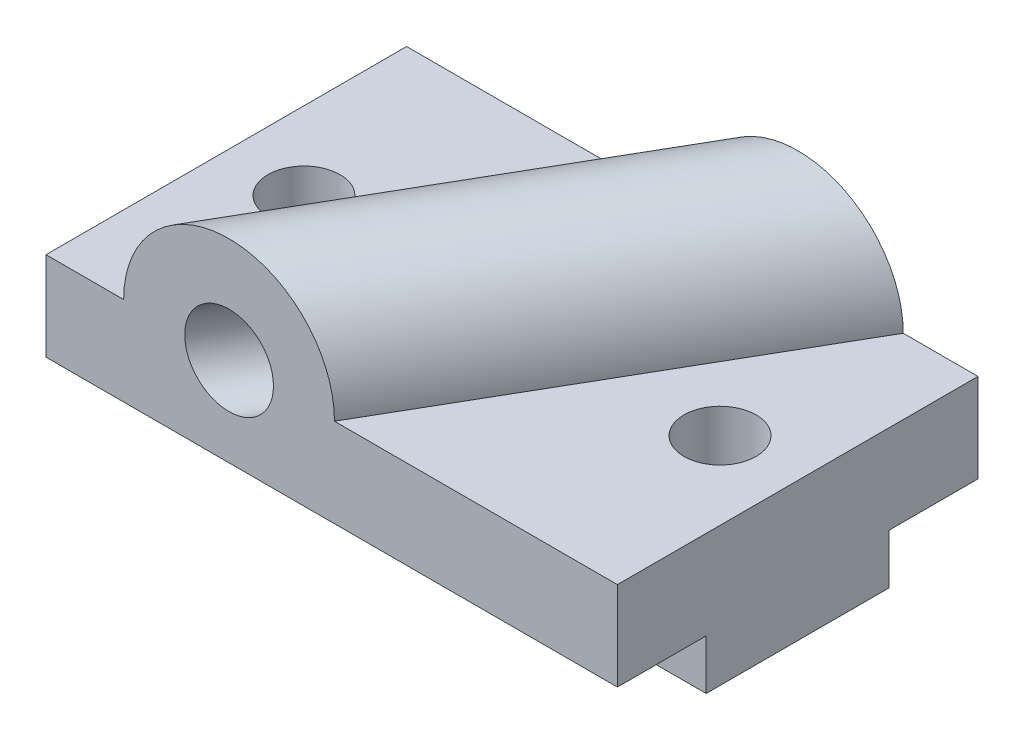
ISO-10303-21;
HEADER;
FILE_DESCRIPTION(('STEP AP214'),'2;1');
FILE_NAME('part.step','',(''),(''),'','','');
FILE_SCHEMA(('AUTOMOTIVE_DESIGN { 1 0 10303 214 1 1 1 1 }'));
ENDSEC;
DATA;
#1=APPLICATION_CONTEXT('core data for automotive mechanical design processes');
#2=APPLICATION_PROTOCOL_DEFINITION('international standard','automotive_design',2000,#1);
#3=PRODUCT_CONTEXT('',#1,'mechanical');
#4=PRODUCT('Part','Part','',(#3));
#5=PRODUCT_RELATED_PRODUCT_CATEGORY('part','',(#4));
#6=PRODUCT_DEFINITION_FORMATION('','',#4);
#7=PRODUCT_DEFINITION_CONTEXT('part definition',#1,'design');
#8=PRODUCT_DEFINITION('design','',#6,#7);
#9=PRODUCT_DEFINITION_SHAPE('','',#8);
#10=(LENGTH_UNIT() NAMED_UNIT(*) SI_UNIT(.MILLI.,.METRE.));
#11=(NAMED_UNIT(*) PLANE_ANGLE_UNIT() SI_UNIT($,.RADIAN.));
#12=(NAMED_UNIT(*) SI_UNIT($,.STERADIAN.) SOLID_ANGLE_UNIT());
#13=UNCERTAINTY_MEASURE_WITH_UNIT(LENGTH_MEASURE(1.E-05),#10,'distance_accuracy_value','');
#14=(GEOMETRIC_REPRESENTATION_CONTEXT(3) GLOBAL_UNCERTAINTY_ASSIGNED_CONTEXT((#13)) GLOBAL_UNIT_ASSIGNED_CONTEXT((#10,
#11,#12)) REPRESENTATION_CONTEXT('',''));
#15=CARTESIAN_POINT('',(0.,0.,0.));
#16=DIRECTION('',(0.,0.,1.));
#17=DIRECTION('',(1.,0.,0.));
#18=AXIS2_PLACEMENT_3D('',#15,#16,#17);
#19=CARTESIAN_POINT('',(51.5,0.,-32.5));
#20=DIRECTION('',(0.,-1.,0.));
#21=DIRECTION('',(0.,0.,-1.));
#22=AXIS2_PLACEMENT_3D('',#19,#20,#21);
#23=PLANE('',#22);
#24=CARTESIAN_POINT('',(37.5,0.,0.));
#25=DIRECTION('',(0.,-1.,0.));
#26=DIRECTION('',(0.,0.,1.));
#27=AXIS2_PLACEMENT_3D('',#24,#25,#26);
#28=CIRCLE('',#27,6.5);
#29=CARTESIAN_POINT('',(37.5,0.,6.5));
#30=VERTEX_POINT('',#29);
#31=EDGE_CURVE('E131',#30,#30,#28,.T.);
#32=ORIENTED_EDGE('',*,*,#31,.T.);
#33=EDGE_LOOP('',(#32));
#34=FACE_BOUND('',#33,.T.);
#35=DIRECTION('',(-1.,0.,0.));
#36=VECTOR('',#35,1.);
#37=CARTESIAN_POINT('',(51.5,0.,-32.5));
#38=LINE('',#37,#36);
#39=CARTESIAN_POINT('',(51.5,0.,-32.5));
#40=VERTEX_POINT('',#39);
#41=CARTESIAN_POINT('',(38.0277674973261,0.,-32.5));
#42=VERTEX_POINT('',#41);
#43=EDGE_CURVE('E48',#40,#42,#38,.T.);
#44=ORIENTED_EDGE('',*,*,#43,.T.);
#45=DIRECTION('',(-0.500000000000004,0.,0.866025403784436));
#46=VECTOR('',#45,1.);
#47=CARTESIAN_POINT('',(60.9135376534405,0.,-72.1393166807332));
#48=LINE('',#47,#46);
#49=CARTESIAN_POINT('',(0.5,0.,32.5));
#50=VERTEX_POINT('',#49);
#51=EDGE_CURVE('E127',#42,#50,#48,.T.);
#52=ORIENTED_EDGE('',*,*,#51,.T.);
#53=DIRECTION('',(-1.,0.,0.));
#54=VECTOR('',#53,1.);
#55=CARTESIAN_POINT('',(51.5,0.,32.5));
#56=LINE('',#55,#54);
#57=CARTESIAN_POINT('',(51.5,0.,32.5));
#58=VERTEX_POINT('',#57);
#59=EDGE_CURVE('E120',#58,#50,#56,.T.);
#60=ORIENTED_EDGE('',*,*,#59,.F.);
#61=DIRECTION('',(0.,0.,1.));
#62=VECTOR('',#61,1.);
#63=CARTESIAN_POINT('',(51.5,0.,-32.5));
#64=LINE('',#63,#62);
#65=EDGE_CURVE('E225',#40,#58,#64,.T.);
#66=ORIENTED_EDGE('',*,*,#65,.F.);
#67=EDGE_LOOP('',(#44,#52,#60,#66));
#68=FACE_BOUND('',#67,.T.);
#69=ADVANCED_FACE('F33',(#34,#68),#23,.F.);
#70=CARTESIAN_POINT('',(51.5,0.,32.5));
#71=DIRECTION('',(0.,0.,-1.));
#72=DIRECTION('',(-1.,0.,0.));
#73=AXIS2_PLACEMENT_3D('',#70,#71,#72);
#74=PLANE('',#73);
#75=CARTESIAN_POINT('',(-18.5,0.,32.5));
#76=DIRECTION('',(0.,0.,1.));
#77=DIRECTION('',(1.,0.,0.));
#78=AXIS2_PLACEMENT_3D('',#75,#76,#77);
#79=CIRCLE('',#78,8.);
#80=CARTESIAN_POINT('',(-10.5,0.,32.5));
#81=VERTEX_POINT('',#80);
#82=EDGE_CURVE('E276',#81,#81,#79,.T.);
#83=ORIENTED_EDGE('',*,*,#82,.F.);
#84=EDGE_LOOP('',(#83));
#85=FACE_BOUND('',#84,.T.);
#86=DIRECTION('',(0.,-1.,0.));
#87=VECTOR('',#86,1.);
#88=CARTESIAN_POINT('',(-51.5,0.,32.5));
#89=LINE('',#88,#87);
#90=CARTESIAN_POINT('',(-51.5,0.,32.5));
#91=VERTEX_POINT('',#90);
#92=CARTESIAN_POINT('',(-51.5,-16.,32.5));
#93=VERTEX_POINT('',#92);
#94=EDGE_CURVE('E204',#91,#93,#89,.T.);
#95=ORIENTED_EDGE('',*,*,#94,.T.);
#96=DIRECTION('',(-1.,0.,0.));
#97=VECTOR('',#96,1.);
#98=CARTESIAN_POINT('',(51.5,-16.,32.5));
#99=LINE('',#98,#97);
#100=CARTESIAN_POINT('',(51.5,-16.,32.5));
#101=VERTEX_POINT('',#100);
#102=EDGE_CURVE('E11',#101,#93,#99,.T.);
#103=ORIENTED_EDGE('',*,*,#102,.F.);
#104=DIRECTION('',(0.,-1.,0.));
#105=VECTOR('',#104,1.);
#106=CARTESIAN_POINT('',(51.5,0.,32.5));
#107=LINE('',#106,#105);
#108=EDGE_CURVE('E209',#58,#101,#107,.T.);
#109=ORIENTED_EDGE('',*,*,#108,.F.);
#110=ORIENTED_EDGE('',*,*,#59,.T.);
#111=CARTESIAN_POINT('',(-18.5,0.,32.5));
#112=DIRECTION('',(0.,0.,1.));
#113=DIRECTION('',(-1.,0.,0.));
#114=AXIS2_PLACEMENT_3D('',#111,#112,#113);
#115=CIRCLE('',#114,19.);
#116=CARTESIAN_POINT('',(-37.5,0.,32.5));
#117=VERTEX_POINT('',#116);
#118=EDGE_CURVE('E128',#50,#117,#115,.T.);
#119=ORIENTED_EDGE('',*,*,#118,.T.);
#120=EDGE_CURVE('E56',#117,#91,#56,.T.);
#121=ORIENTED_EDGE('',*,*,#120,.T.);
#122=EDGE_LOOP('',(#95,#103,#109,#110,#119,#121));
#123=FACE_BOUND('',#122,.T.);
#124=ADVANCED_FACE('F35',(#85,#123),#74,.F.);
#125=CARTESIAN_POINT('',(51.5,-16.,32.5));
#126=DIRECTION('',(0.,1.,0.));
#127=DIRECTION('',(0.,0.,1.));
#128=AXIS2_PLACEMENT_3D('',#125,#126,#127);
#129=PLANE('',#128);
#130=DIRECTION('',(0.,0.,-1.));
#131=VECTOR('',#130,1.);
#132=CARTESIAN_POINT('',(-51.5,-16.,32.5));
#133=LINE('',#132,#131);
#134=CARTESIAN_POINT('',(-51.5,-16.,16.5));
#135=VERTEX_POINT('',#134);
#136=EDGE_CURVE('E229',#93,#135,#133,.T.);
#137=ORIENTED_EDGE('',*,*,#136,.T.);
#138=DIRECTION('',(-1.,0.,0.));
#139=VECTOR('',#138,1.);
#140=CARTESIAN_POINT('',(51.5,-16.,16.5));
#141=LINE('',#140,#139);
#142=CARTESIAN_POINT('',(51.5,-16.,16.5));
#143=VERTEX_POINT('',#142);
#144=EDGE_CURVE('E41',#143,#135,#141,.T.);
#145=ORIENTED_EDGE('',*,*,#144,.F.);
#146=DIRECTION('',(0.,0.,-1.));
#147=VECTOR('',#146,1.);
#148=CARTESIAN_POINT('',(51.5,-16.,32.5));
#149=LINE('',#148,#147);
#150=EDGE_CURVE('E212',#101,#143,#149,.T.);
#151=ORIENTED_EDGE('',*,*,#150,.F.);
#152=ORIENTED_EDGE('',*,*,#102,.T.);
#153=EDGE_LOOP('',(#137,#145,#151,#152));
#154=FACE_BOUND('',#153,.T.);
#155=ADVANCED_FACE('F176',(#154),#129,.F.);
#156=CARTESIAN_POINT('',(51.5,-16.,16.5));
#157=DIRECTION('',(0.,0.,-1.));
#158=DIRECTION('',(0.,1.,0.));
#159=AXIS2_PLACEMENT_3D('',#156,#157,#158);
#160=PLANE('',#159);
#161=DIRECTION('',(0.,-1.,0.));
#162=VECTOR('',#161,1.);
#163=CARTESIAN_POINT('',(-51.5,-16.,16.5));
#164=LINE('',#163,#162);
#165=CARTESIAN_POINT('',(-51.5,-25.,16.5));
#166=VERTEX_POINT('',#165);
#167=EDGE_CURVE('E231',#135,#166,#164,.T.);
#168=ORIENTED_EDGE('',*,*,#167,.T.);
#169=DIRECTION('',(-1.,0.,0.));
#170=VECTOR('',#169,1.);
#171=CARTESIAN_POINT('',(51.5,-25.,16.5));
#172=LINE('',#171,#170);
#173=CARTESIAN_POINT('',(51.5,-25.,16.5));
#174=VERTEX_POINT('',#173);
#175=EDGE_CURVE('E251',#174,#166,#172,.T.);
#176=ORIENTED_EDGE('',*,*,#175,.F.);
#177=DIRECTION('',(0.,-1.,0.));
#178=VECTOR('',#177,1.);
#179=CARTESIAN_POINT('',(51.5,-16.,16.5));
#180=LINE('',#179,#178);
#181=EDGE_CURVE('E215',#143,#174,#180,.T.);
#182=ORIENTED_EDGE('',*,*,#181,.F.);
#183=ORIENTED_EDGE('',*,*,#144,.T.);
#184=EDGE_LOOP('',(#168,#176,#182,#183));
#185=FACE_BOUND('',#184,.T.);
#186=ADVANCED_FACE('F173',(#185),#160,.F.);
#187=CARTESIAN_POINT('',(51.5,-25.,16.5));
#188=DIRECTION('',(0.,1.,0.));
#189=DIRECTION('',(0.,0.,1.));
#190=AXIS2_PLACEMENT_3D('',#187,#188,#189);
#191=PLANE('',#190);
#192=CARTESIAN_POINT('',(37.5,-25.,0.));
#193=DIRECTION('',(0.,-1.,0.));
#194=DIRECTION('',(0.,0.,1.));
#195=AXIS2_PLACEMENT_3D('',#192,#193,#194);
#196=CIRCLE('',#195,6.5);
#197=CARTESIAN_POINT('',(37.5,-25.,6.5));
#198=VERTEX_POINT('',#197);
#199=EDGE_CURVE('E134',#198,#198,#196,.T.);
#200=ORIENTED_EDGE('',*,*,#199,.F.);
#201=EDGE_LOOP('',(#200));
#202=FACE_BOUND('',#201,.T.);
#203=CARTESIAN_POINT('',(-37.5,-25.,0.));
#204=DIRECTION('',(0.,1.,0.));
#205=DIRECTION('',(0.,0.,1.));
#206=AXIS2_PLACEMENT_3D('',#203,#204,#205);
#207=CIRCLE('',#206,6.5);
#208=CARTESIAN_POINT('',(-37.5,-25.,6.5));
#209=VERTEX_POINT('',#208);
#210=EDGE_CURVE('E201',#209,#209,#207,.T.);
#211=ORIENTED_EDGE('',*,*,#210,.T.);
#212=EDGE_LOOP('',(#211));
#213=FACE_BOUND('',#212,.T.);
#214=DIRECTION('',(0.,0.,-1.));
#215=VECTOR('',#214,1.);
#216=CARTESIAN_POINT('',(-51.5,-25.,16.5));
#217=LINE('',#216,#215);
#218=CARTESIAN_POINT('',(-51.5,-25.,-16.5));
#219=VERTEX_POINT('',#218);
#220=EDGE_CURVE('E233',#166,#219,#217,.T.);
#221=ORIENTED_EDGE('',*,*,#220,.T.);
#222=DIRECTION('',(-1.,0.,0.));
#223=VECTOR('',#222,1.);
#224=CARTESIAN_POINT('',(51.5,-25.,-16.5));
#225=LINE('',#224,#223);
#226=CARTESIAN_POINT('',(51.5,-25.,-16.5));
#227=VERTEX_POINT('',#226);
#228=EDGE_CURVE('E248',#227,#219,#225,.T.);
#229=ORIENTED_EDGE('',*,*,#228,.F.);
#230=DIRECTION('',(0.,0.,-1.));
#231=VECTOR('',#230,1.);
#232=CARTESIAN_POINT('',(51.5,-25.,16.5));
#233=LINE('',#232,#231);
#234=EDGE_CURVE('E217',#174,#227,#233,.T.);
#235=ORIENTED_EDGE('',*,*,#234,.F.);
#236=ORIENTED_EDGE('',*,*,#175,.T.);
#237=EDGE_LOOP('',(#221,#229,#235,#236));
#238=FACE_BOUND('',#237,.T.);
#239=ADVANCED_FACE('F169',(#202,#213,#238),#191,.F.);
#240=CARTESIAN_POINT('',(51.5,-16.,-16.5));
#241=DIRECTION('',(0.,0.,1.));
#242=DIRECTION('',(0.,-1.,0.));
#243=AXIS2_PLACEMENT_3D('',#240,#241,#242);
#244=PLANE('',#243);
#245=DIRECTION('',(0.,1.,0.));
#246=VECTOR('',#245,1.);
#247=CARTESIAN_POINT('',(-51.5,-16.,-16.5));
#248=LINE('',#247,#246);
#249=CARTESIAN_POINT('',(-51.5,-16.,-16.5));
#250=VERTEX_POINT('',#249);
#251=EDGE_CURVE('E235',#219,#250,#248,.T.);
#252=ORIENTED_EDGE('',*,*,#251,.T.);
#253=DIRECTION('',(-1.,0.,0.));
#254=VECTOR('',#253,1.);
#255=CARTESIAN_POINT('',(51.5,-16.,-16.5));
#256=LINE('',#255,#254);
#257=CARTESIAN_POINT('',(51.5,-16.,-16.5));
#258=VERTEX_POINT('',#257);
#259=EDGE_CURVE('E245',#258,#250,#256,.T.);
#260=ORIENTED_EDGE('',*,*,#259,.F.);
#261=DIRECTION('',(0.,1.,0.));
#262=VECTOR('',#261,1.);
#263=CARTESIAN_POINT('',(51.5,-16.,-16.5));
#264=LINE('',#263,#262);
#265=EDGE_CURVE('E219',#227,#258,#264,.T.);
#266=ORIENTED_EDGE('',*,*,#265,.F.);
#267=ORIENTED_EDGE('',*,*,#228,.T.);
#268=EDGE_LOOP('',(#252,#260,#266,#267));
#269=FACE_BOUND('',#268,.T.);
#270=ADVANCED_FACE('F165',(#269),#244,.F.);
#271=CARTESIAN_POINT('',(51.5,-16.,-32.5));
#272=DIRECTION('',(0.,1.,0.));
#273=DIRECTION('',(0.,0.,1.));
#274=AXIS2_PLACEMENT_3D('',#271,#272,#273);
#275=PLANE('',#274);
#276=DIRECTION('',(0.,0.,-1.));
#277=VECTOR('',#276,1.);
#278=CARTESIAN_POINT('',(-51.5,-16.,-32.5));
#279=LINE('',#278,#277);
#280=CARTESIAN_POINT('',(-51.5,-16.,-32.5));
#281=VERTEX_POINT('',#280);
#282=EDGE_CURVE('E237',#250,#281,#279,.T.);
#283=ORIENTED_EDGE('',*,*,#282,.T.);
#284=DIRECTION('',(-1.,0.,0.));
#285=VECTOR('',#284,1.);
#286=CARTESIAN_POINT('',(51.5,-16.,-32.5));
#287=LINE('',#286,#285);
#288=CARTESIAN_POINT('',(51.5,-16.,-32.5));
#289=VERTEX_POINT('',#288);
#290=EDGE_CURVE('E243',#289,#281,#287,.T.);
#291=ORIENTED_EDGE('',*,*,#290,.F.);
#292=DIRECTION('',(0.,0.,-1.));
#293=VECTOR('',#292,1.);
#294=CARTESIAN_POINT('',(51.5,-16.,-32.5));
#295=LINE('',#294,#293);
#296=EDGE_CURVE('E221',#258,#289,#295,.T.);
#297=ORIENTED_EDGE('',*,*,#296,.F.);
#298=ORIENTED_EDGE('',*,*,#259,.T.);
#299=EDGE_LOOP('',(#283,#291,#297,#298));
#300=FACE_BOUND('',#299,.T.);
#301=ADVANCED_FACE('F160',(#300),#275,.F.);
#302=CARTESIAN_POINT('',(51.5,0.,-32.5));
#303=DIRECTION('',(0.,0.,1.));
#304=DIRECTION('',(0.,-1.,0.));
#305=AXIS2_PLACEMENT_3D('',#302,#303,#304);
#306=PLANE('',#305);
#307=CARTESIAN_POINT('',(27.0277674973261,0.,-32.5));
#308=CARTESIAN_POINT('',(27.0277668934125,-0.25037024192059,-32.5));
#309=CARTESIAN_POINT('',(27.0160036016839,-0.500745485804355,-32.5));
#310=CARTESIAN_POINT('',(26.9717543084445,-0.970679986246838,-32.5));
#311=CARTESIAN_POINT('',(26.941798554542,-1.19048147463339,-32.5));
#312=CARTESIAN_POINT('',(26.8637266695117,-1.62693006358756,-32.5));
#313=CARTESIAN_POINT('',(26.8156035820322,-1.8435759228073,-32.5));
#314=CARTESIAN_POINT('',(26.7015417819432,-2.2720777054905,-32.5));
#315=CARTESIAN_POINT('',(26.6356066034771,-2.48393457012417,-32.5));
#316=CARTESIAN_POINT('',(26.4863708352318,-2.9014449039692,-32.5));
#317=CARTESIAN_POINT('',(26.403070012936,-3.10709829007713,-32.5));
#318=CARTESIAN_POINT('',(26.2196805867293,-3.51077368791321,-32.5));
#319=CARTESIAN_POINT('',(26.1195922952792,-3.70879584159513,-32.5));
#320=CARTESIAN_POINT('',(25.903315573386,-4.09584989016812,-32.5));
#321=CARTESIAN_POINT('',(25.7871267593069,-4.28488157069403,-32.5));
#322=CARTESIAN_POINT('',(25.5394757366801,-4.65261066016034,-32.5));
#323=CARTESIAN_POINT('',(25.408016283365,-4.83130992465791,-32.5));
#324=CARTESIAN_POINT('',(25.1306681273749,-5.17723545722592,-32.5));
#325=CARTESIAN_POINT('',(24.9847745837955,-5.34445784411761,-32.5));
#326=CARTESIAN_POINT('',(24.6796564839025,-5.66615212859088,-32.5));
#327=CARTESIAN_POINT('',(24.5204365789175,-5.82062843788804,-32.5));
#328=CARTESIAN_POINT('',(24.1896618869464,-6.11588182450932,-32.5));
#329=CARTESIAN_POINT('',(24.0181026936022,-6.25665396541896,-32.5));
#330=CARTESIAN_POINT('',(23.6639186351082,-6.523438399736,-32.5));
#331=CARTESIAN_POINT('',(23.4812958447609,-6.64945344768133,-32.5));
#332=CARTESIAN_POINT('',(23.1062141233908,-6.88588559690138,-32.5));
#333=CARTESIAN_POINT('',(22.9137550433349,-6.99630246174727,-32.5));
#334=CARTESIAN_POINT('',(22.5203364416122,-7.2007713254648,-32.5));
#335=CARTESIAN_POINT('',(22.319377081443,-7.29482363507508,-32.5));
#336=CARTESIAN_POINT('',(21.9103378484012,-7.46591828828085,-32.5));
#337=CARTESIAN_POINT('',(21.7022578131003,-7.54296024355767,-32.5));
#338=CARTESIAN_POINT('',(21.2804568499433,-7.67948701425732,-32.5));
#339=CARTESIAN_POINT('',(21.0667369420778,-7.73897498099225,-32.5));
#340=CARTESIAN_POINT('',(20.6350233107408,-7.8400186120564,-32.5));
#341=CARTESIAN_POINT('',(20.4170281733471,-7.88156823550301,-32.5));
#342=CARTESIAN_POINT('',(19.9784166045582,-7.94640769991347,-32.5));
#343=CARTESIAN_POINT('',(19.757801110593,-7.96970388248882,-32.5));
#344=CARTESIAN_POINT('',(19.3153181438214,-7.99790465105698,-32.5));
#345=CARTESIAN_POINT('',(19.0934502501075,-8.00280263347833,-32.5));
#346=CARTESIAN_POINT('',(18.6501157128349,-7.99415568130623,-32.5));
#347=CARTESIAN_POINT('',(18.4286490020145,-7.98061419458141,-32.5));
#348=CARTESIAN_POINT('',(17.9876015188568,-7.93518758899345,-32.5));
#349=CARTESIAN_POINT('',(17.7680207751536,-7.90330219211983,-32.5));
#350=CARTESIAN_POINT('',(17.3322695290742,-7.82140857850279,-32.5));
#351=CARTESIAN_POINT('',(17.1160989620147,-7.7714007059344,-32.5));
#352=CARTESIAN_POINT('',(16.6886519987975,-7.65360610436189,-32.5));
#353=CARTESIAN_POINT('',(16.4773757144668,-7.58581896956305,-32.5));
#354=CARTESIAN_POINT('',(16.0612192588753,-7.43294838341357,-32.5));
#355=CARTESIAN_POINT('',(15.8563379454947,-7.34786804119663,-32.5));
#356=CARTESIAN_POINT('',(15.4542786659982,-7.16095947897551,-32.5));
#357=CARTESIAN_POINT('',(15.2571033152259,-7.05912563301219,-32.5));
#358=CARTESIAN_POINT('',(14.8719583782003,-6.83947217435094,-32.5));
#359=CARTESIAN_POINT('',(14.6839856160801,-6.72165813019714,-32.5));
#360=CARTESIAN_POINT('',(14.3184046777082,-6.4707855794273,-32.5));
#361=CARTESIAN_POINT('',(14.1408002454203,-6.3377216168916,-32.5));
#362=CARTESIAN_POINT('',(13.7972885182753,-6.0573290794712,-32.5));
#363=CARTESIAN_POINT('',(13.6313790427597,-5.91000317611223,-32.5));
#364=CARTESIAN_POINT('',(13.3123642198429,-5.60208110536356,-32.5));
#365=CARTESIAN_POINT('',(13.159259066537,-5.44148473688594,-32.5));
#366=CARTESIAN_POINT('',(12.8669160538861,-5.10813615754935,-32.5));
#367=CARTESIAN_POINT('',(12.7276779312471,-4.93538417759598,-32.5));
#368=CARTESIAN_POINT('',(12.4640243786684,-4.57891078625463,-32.5));
#369=CARTESIAN_POINT('',(12.3396092871471,-4.39518912456626,-32.5));
#370=CARTESIAN_POINT('',(12.106485851556,-4.01808293860107,-32.5));
#371=CARTESIAN_POINT('',(11.9977746900924,-3.82470015599565,-32.5));
#372=CARTESIAN_POINT('',(11.7967492918515,-3.42950999404714,-32.5));
#373=CARTESIAN_POINT('',(11.7044405848729,-3.22769980176264,-32.5));
#374=CARTESIAN_POINT('',(11.5369319509484,-2.81718155763825,-32.5));
#375=CARTESIAN_POINT('',(11.4617260978403,-2.60847592387434,-32.5));
#376=CARTESIAN_POINT('',(11.3288776836,-2.18546557161557,-32.5));
#377=CARTESIAN_POINT('',(11.2712414163152,-1.97115887646408,-32.5));
#378=CARTESIAN_POINT('',(11.1739760386693,-1.53854001553286,-32.5));
#379=CARTESIAN_POINT('',(11.1343435239267,-1.3202286151439,-32.5));
#380=CARTESIAN_POINT('',(11.0733427262969,-0.881064226289838,-32.5));
#381=CARTESIAN_POINT('',(11.0519748209687,-0.660211185380545,-32.5));
#382=CARTESIAN_POINT('',(11.0276523679195,-0.217495930765572,-32.5));
#383=CARTESIAN_POINT('',(11.0246976182112,0.00436627184315826,-32.5));
#384=CARTESIAN_POINT('',(11.0372213522728,0.447570085921332,-32.5));
#385=CARTESIAN_POINT('',(11.0526998594312,0.668911696729882,-32.5));
#386=CARTESIAN_POINT('',(11.1019834750185,1.10954732170177,-32.5));
#387=CARTESIAN_POINT('',(11.1357887613222,1.32884131597046,-32.5));
#388=CARTESIAN_POINT('',(11.2214916482733,1.76386025107292,-32.5));
#389=CARTESIAN_POINT('',(11.2733888747492,1.97958526562248,-32.5));
#390=CARTESIAN_POINT('',(11.3949281669073,2.40601887389497,-32.5));
#391=CARTESIAN_POINT('',(11.464573389397,2.61672656789718,-32.5));
#392=CARTESIAN_POINT('',(11.6210966527614,3.03156019090195,-32.5));
#393=CARTESIAN_POINT('',(11.7079689085944,3.23568830272636,-32.5));
#394=CARTESIAN_POINT('',(11.898378162321,3.63606317314218,-32.5));
#395=CARTESIAN_POINT('',(12.0019181415542,3.83230851388847,-32.5));
#396=CARTESIAN_POINT('',(12.2249339933091,4.21551916589132,-32.5));
#397=CARTESIAN_POINT('',(12.3444095028382,4.40248468839814,-32.5));
#398=CARTESIAN_POINT('',(12.5984754268482,4.76585258036389,-32.5));
#399=CARTESIAN_POINT('',(12.7330661280364,4.94225474935809,-32.5));
#400=CARTESIAN_POINT('',(13.0164287549545,5.28327099606983,-32.5));
#401=CARTESIAN_POINT('',(13.1652004655669,5.44788525253666,-32.5));
#402=CARTESIAN_POINT('',(13.475928363633,5.76422123517495,-32.5));
#403=CARTESIAN_POINT('',(13.6378870113515,5.91594054471652,-32.5));
#404=CARTESIAN_POINT('',(13.9737851505587,6.205351842536,-32.5));
#405=CARTESIAN_POINT('',(14.1477203229403,6.34304884374433,-32.5));
#406=CARTESIAN_POINT('',(14.5064847008418,6.6035721356737,-32.5));
#407=CARTESIAN_POINT('',(14.6913176731334,6.7263932392792,-32.5));
#408=CARTESIAN_POINT('',(15.0704817289524,6.95622163969038,-32.5));
#409=CARTESIAN_POINT('',(15.2648095965644,7.0632342420905,-32.5));
#410=CARTESIAN_POINT('',(15.6617147731862,7.26077383915582,-32.5));
#411=CARTESIAN_POINT('',(15.8642935580412,7.35129786851617,-32.5));
#412=CARTESIAN_POINT('',(16.2762637905176,7.51520943637088,-32.5));
#413=CARTESIAN_POINT('',(16.485655082531,7.58859736596731,-32.5));
#414=CARTESIAN_POINT('',(16.9098124960069,7.71773373189173,-32.5));
#415=CARTESIAN_POINT('',(17.124578719467,7.773481833202,-32.5));
#416=CARTESIAN_POINT('',(17.5579953783265,7.86695085864912,-32.5));
#417=CARTESIAN_POINT('',(17.7766457548087,7.90467205598646,-32.5));
#418=CARTESIAN_POINT('',(18.2163648364385,7.96183332758997,-32.5));
#419=CARTESIAN_POINT('',(18.4374339861497,7.98126998210682,-32.5));
#420=CARTESIAN_POINT('',(18.8803432123163,8.00171201251627,-32.5));
#421=CARTESIAN_POINT('',(19.1021829837388,8.00272399834641,-32.5));
#422=CARTESIAN_POINT('',(19.5452578034989,7.98632373873258,-32.5));
#423=CARTESIAN_POINT('',(19.7664926147587,7.96890508715048,-32.5));
#424=CARTESIAN_POINT('',(20.2066771020577,7.91576290049959,-32.5));
#425=CARTESIAN_POINT('',(20.4256275217435,7.88004552484873,-32.5));
#426=CARTESIAN_POINT('',(20.8598461029322,7.79054784132127,-32.5));
#427=CARTESIAN_POINT('',(21.0751135958035,7.73676428936376,-32.5));
#428=CARTESIAN_POINT('',(21.5004340915582,7.61150874892242,-32.5));
#429=CARTESIAN_POINT('',(21.710487213351,7.54003716420813,-32.5));
#430=CARTESIAN_POINT('',(22.1239371644334,7.37989706813818,-32.5));
#431=CARTESIAN_POINT('',(22.3273338672403,7.2912282302282,-32.5));
#432=CARTESIAN_POINT('',(22.7260588084339,7.09730845271303,-32.5));
#433=CARTESIAN_POINT('',(22.9213871690535,6.99205776443394,-32.5));
#434=CARTESIAN_POINT('',(23.3026652477148,6.76567908165695,-32.5));
#435=CARTESIAN_POINT('',(23.4886132052273,6.64454812196326,-32.5));
#436=CARTESIAN_POINT('',(23.8497415199353,6.3873073812732,-32.5));
#437=CARTESIAN_POINT('',(24.0249257161263,6.25120298959065,-32.5));
#438=CARTESIAN_POINT('',(24.3634484479659,5.9648698124341,-32.5));
#439=CARTESIAN_POINT('',(24.5267828401633,5.81463612821749,-32.5));
#440=CARTESIAN_POINT('',(24.8403571801535,5.50117545332393,-32.5));
#441=CARTESIAN_POINT('',(24.990601522096,5.33795285832381,-32.5));
#442=CARTESIAN_POINT('',(25.2770472675185,4.99956505752789,-32.5));
#443=CARTESIAN_POINT('',(25.4132460051217,4.82439759502097,-32.5));
#444=CARTESIAN_POINT('',(25.6706216945406,4.4633656947938,-32.5));
#445=CARTESIAN_POINT('',(25.7917992739591,4.27750170446328,-32.5));
#446=CARTESIAN_POINT('',(26.0183040555221,3.8963498920904,-32.5));
#447=CARTESIAN_POINT('',(26.1236310867183,3.70106196844071,-32.5));
#448=CARTESIAN_POINT('',(26.3177057982056,3.30241602282919,-32.5));
#449=CARTESIAN_POINT('',(26.4064531430803,3.09905783770226,-32.5));
#450=CARTESIAN_POINT('',(26.574242862087,2.66635586399394,-32.5));
#451=CARTESIAN_POINT('',(26.6516056584995,2.43635854391506,-32.5));
#452=CARTESIAN_POINT('',(26.7851080935685,1.97037948249823,-32.5));
#453=CARTESIAN_POINT('',(26.8412549669566,1.73439981051574,-32.5));
#454=CARTESIAN_POINT('',(26.9335137826633,1.24985279291571,-32.5));
#455=CARTESIAN_POINT('',(26.968843423257,1.00113603078799,-32.5));
#456=CARTESIAN_POINT('',(27.0159647188079,0.501613783351572,-32.5));
#457=CARTESIAN_POINT('',(27.027768102299,0.250809401438714,-32.5));
#458=CARTESIAN_POINT('',(27.0277674973261,0.,-32.5));
#459=B_SPLINE_CURVE_WITH_KNOTS('',3,(#307,#308,#309,#310,#311,#312,#313,#314,#315,#316,#317,
#318,#319,#320,#321,#322,#323,#324,#325,#326,#327,#328,#329,#330,#331,#332,#333,#334,#335,#336,
#337,#338,#339,#340,#341,#342,#343,#344,#345,#346,#347,#348,#349,#350,#351,#352,#353,#354,#355,
#356,#357,#358,#359,#360,#361,#362,#363,#364,#365,#366,#367,#368,#369,#370,#371,#372,#373,#374,
#375,#376,#377,#378,#379,#380,#381,#382,#383,#384,#385,#386,#387,#388,#389,#390,#391,#392,#393,
#394,#395,#396,#397,#398,#399,#400,#401,#402,#403,#404,#405,#406,#407,#408,#409,#410,#411,#412,
#413,#414,#415,#416,#417,#418,#419,#420,#421,#422,#423,#424,#425,#426,#427,#428,#429,#430,#431,
#432,#433,#434,#435,#436,#437,#438,#439,#440,#441,#442,#443,#444,#445,#446,#447,#448,#449,#450,
#451,#452,#453,#454,#455,#456,#457,#458),.UNSPECIFIED.,.T.,.F.,(4,2,2,2,2,2,2,2,2,2,2,2,2,2,2,2,
2,2,2,2,2,2,2,2,2,2,2,2,2,2,2,2,2,2,2,2,2,2,2,2,2,2,2,2,2,2,2,2,2,2,2,2,2,2,2,2,2,2,2,2,2,2,2,2,
2,2,2,2,2,2,2,2,2,2,2,4),(0.,0.750827159476837,1.41557952218455,2.08058668007906,
2.74546198895521,3.41034620072353,4.07521803854966,4.74010572136781,5.40487362641965,
6.06986524197978,6.73462571433479,7.39962476258733,8.06449948454424,8.72938428323196,
9.39425645536476,10.0591438038762,10.7239117183327,11.3889033244881,12.0536637966547,
12.7186628450955,13.3835375670424,14.0484223657399,14.7132945378648,15.3781818863842,
16.0429498008407,16.7079414069961,17.372701879155,18.0377009276037,18.7025756495643,
19.3674604482483,20.0323326203193,20.6972199688926,21.3619878835288,22.0269794895046,
22.6917403227054,23.3567390101122,24.0216118986008,24.6864985307565,25.3513778692721,
26.016258051401,26.6811446867969,27.3460175720453,28.0110087998085,28.6757770926574,
29.3406644243619,30.0055366133017,30.6704214157749,31.3352961339463,32.0002951821673,
32.6650556545539,33.3300472607178,33.9948151751659,34.6597025236861,35.3245746958101,
35.9894594945075,36.6543342164546,37.3193332648955,37.984093737062,38.6490853432187,
39.3138532576738,39.9787406060781,40.6436127783181,41.308497576885,41.9733722989627,
42.638371345058,43.3031318195702,43.9681236277117,44.6328913401821,45.2977849952333,
45.9626508608261,46.6275238964965,47.2924103814705,48.0193704622347,48.7460824219263,
49.4986018096322,50.2507459502767),.UNSPECIFIED.);
#460=CARTESIAN_POINT('',(27.0277674973261,0.,-32.5));
#461=VERTEX_POINT('',#460);
#462=EDGE_CURVE('E145',#461,#461,#459,.T.);
#463=ORIENTED_EDGE('',*,*,#462,.F.);
#464=EDGE_LOOP('',(#463));
#465=FACE_BOUND('',#464,.T.);
#466=DIRECTION('',(0.,1.,0.));
#467=VECTOR('',#466,1.);
#468=CARTESIAN_POINT('',(-51.5,0.,-32.5));
#469=LINE('',#468,#467);
#470=CARTESIAN_POINT('',(-51.5,0.,-32.5));
#471=VERTEX_POINT('',#470);
#472=EDGE_CURVE('E118',#281,#471,#469,.T.);
#473=ORIENTED_EDGE('',*,*,#472,.T.);
#474=CARTESIAN_POINT('',(0.027767497326095,0.,-32.5));
#475=VERTEX_POINT('',#474);
#476=EDGE_CURVE('E111',#475,#471,#38,.T.);
#477=ORIENTED_EDGE('',*,*,#476,.F.);
#478=CARTESIAN_POINT('',(0.0277674973260967,0.,-32.5));
#479=CARTESIAN_POINT('',(0.0277683435885489,0.305169827066179,-32.5));
#480=CARTESIAN_POINT('',(0.0351214247813102,0.610289833121558,-32.5));
#481=CARTESIAN_POINT('',(0.0645091340845979,1.2198244972222,-32.5));
#482=CARTESIAN_POINT('',(0.0865438846937698,1.52423914936098,-32.5));
#483=CARTESIAN_POINT('',(0.174648920406675,2.43564177303598,-32.5));
#484=CARTESIAN_POINT('',(0.262719970313562,3.04065434236141,-32.5));
#485=CARTESIAN_POINT('',(0.495980661812194,4.23575660726679,-32.5));
#486=CARTESIAN_POINT('',(0.640833927634013,4.82591279101277,-32.5));
#487=CARTESIAN_POINT('',(0.986294074872114,5.98940803208729,-32.5));
#488=CARTESIAN_POINT('',(1.18686435861151,6.56275785629231,-32.5));
#489=CARTESIAN_POINT('',(1.51305683615211,7.36914998254456,-32.5));
#490=CARTESIAN_POINT('',(1.61688277515558,7.61120541870222,-32.5));
#491=CARTESIAN_POINT('',(1.83447378749559,8.09073188401972,-32.5));
#492=CARTESIAN_POINT('',(1.94823609322634,8.32820416738079,-32.5));
#493=CARTESIAN_POINT('',(2.30412820446693,9.03309588578302,-32.5));
#494=CARTESIAN_POINT('',(2.56094948791642,9.49320341249124,-32.5));
#495=CARTESIAN_POINT('',(3.1119126130077,10.3905209950474,-32.5));
#496=CARTESIAN_POINT('',(3.40606143963496,10.827726743669,-32.5));
#497=CARTESIAN_POINT('',(4.02969863047596,11.6762592049529,-32.5));
#498=CARTESIAN_POINT('',(4.35918641722013,12.0875863403203,-32.5));
#499=CARTESIAN_POINT('',(4.87811054266356,12.6829257118788,-32.5));
#500=CARTESIAN_POINT('',(5.05523489020659,12.8777968621957,-32.5));
#501=CARTESIAN_POINT('',(5.41738208849545,13.2599657377352,-32.5));
#502=CARTESIAN_POINT('',(5.60240298517197,13.4472653145259,-32.5));
#503=CARTESIAN_POINT('',(6.16892833201944,13.997402490328,-32.5));
#504=CARTESIAN_POINT('',(6.56193758977756,14.3485268807021,-32.5));
#505=CARTESIAN_POINT('',(7.37571033252562,15.0168868430537,-32.5));
#506=CARTESIAN_POINT('',(7.79647410631131,15.3341220623121,-32.5));
#507=CARTESIAN_POINT('',(8.66290751898712,15.9325720329526,-32.5));
#508=CARTESIAN_POINT('',(9.10857734964837,16.2137865069279,-32.5));
#509=CARTESIAN_POINT('',(10.0217246269483,16.7382324784426,-32.5));
#510=CARTESIAN_POINT('',(10.4892020116677,16.9814640838198,-32.5));
#511=CARTESIAN_POINT('',(11.4427397916777,17.4282691700337,-32.5));
#512=CARTESIAN_POINT('',(11.9288001493832,17.6318427310758,-32.5));
#513=CARTESIAN_POINT('',(12.9161466746875,17.9979251630222,-32.5));
#514=CARTESIAN_POINT('',(13.4174328537632,18.1604340029723,-32.5));
#515=CARTESIAN_POINT('',(14.4317687181051,18.44326469078,-32.5));
#516=CARTESIAN_POINT('',(14.9448184094279,18.5635865169168,-32.5));
#517=CARTESIAN_POINT('',(15.9791370938607,18.7612118610833,-32.5));
#518=CARTESIAN_POINT('',(16.5004060853565,18.8385153875616,-32.5));
#519=CARTESIAN_POINT('',(17.5475628815656,18.9495702285872,-32.5));
#520=CARTESIAN_POINT('',(18.073450685715,18.9833215484515,-32.5));
#521=CARTESIAN_POINT('',(19.1262127474579,19.0070388587656,-32.5));
#522=CARTESIAN_POINT('',(19.653087005108,18.9970048467081,-32.5));
#523=CARTESIAN_POINT('',(20.704182687738,18.9332207969542,-32.5));
#524=CARTESIAN_POINT('',(21.2284041126981,18.8794707589277,-32.5));
#525=CARTESIAN_POINT('',(22.2705731653383,18.7286259239339,-32.5));
#526=CARTESIAN_POINT('',(22.7885207933082,18.6315311289678,-32.5));
#527=CARTESIAN_POINT('',(23.8145647129488,18.3946674370691,-32.5));
#528=CARTESIAN_POINT('',(24.3226610037842,18.2548985365182,-32.5));
#529=CARTESIAN_POINT('',(25.3254927335034,17.9336520104144,-32.5));
#530=CARTESIAN_POINT('',(25.8202281705771,17.7521743792109,-32.5));
#531=CARTESIAN_POINT('',(26.7929206073296,17.348764083139,-32.5));
#532=CARTESIAN_POINT('',(27.2708776129772,17.1268314326624,-32.5));
#533=CARTESIAN_POINT('',(28.206712023027,16.6440437717759,-32.5));
#534=CARTESIAN_POINT('',(28.6645894374344,16.3831887807602,-32.5));
#535=CARTESIAN_POINT('',(29.5571018745163,15.8243590828448,-32.5));
#536=CARTESIAN_POINT('',(29.9917368657594,15.5263843257487,-32.5));
#537=CARTESIAN_POINT('',(30.8347660329753,14.8953681009474,-32.5));
#538=CARTESIAN_POINT('',(31.2431601613331,14.5623265696153,-32.5));
#539=CARTESIAN_POINT('',(32.0308703611606,13.8634976631481,-32.5));
#540=CARTESIAN_POINT('',(32.4101865774653,13.4977104511365,-32.5));
#541=CARTESIAN_POINT('',(33.1371712861999,12.7358496454269,-32.5));
#542=CARTESIAN_POINT('',(33.4848399819203,12.3397762463047,-32.5));
#543=CARTESIAN_POINT('',(33.9806852435584,11.7251698249262,-32.5));
#544=CARTESIAN_POINT('',(34.1416988525044,11.5168729408885,-32.5));
#545=CARTESIAN_POINT('',(34.4549745376035,11.093718946848,-32.5));
#546=CARTESIAN_POINT('',(34.6072344371296,10.8788602253935,-32.5));
#547=CARTESIAN_POINT('',(35.0503615409615,10.225140943741,-32.5));
#548=CARTESIAN_POINT('',(35.327693049306,9.77699233591486,-32.5));
#549=CARTESIAN_POINT('',(35.8441511796869,8.85926433482534,-32.5));
#550=CARTESIAN_POINT('',(36.0832775036908,8.38968477441939,-32.5));
#551=CARTESIAN_POINT('',(36.5216958585775,7.43233496042508,-32.5));
#552=CARTESIAN_POINT('',(36.7209921660857,6.94456666647655,-32.5));
#553=CARTESIAN_POINT('',(37.078436963418,5.95403915255305,-32.5));
#554=CARTESIAN_POINT('',(37.2365769237565,5.45127684915599,-32.5));
#555=CARTESIAN_POINT('',(37.481859602497,4.54090861645816,-32.5));
#556=CARTESIAN_POINT('',(37.5769348245346,4.13541883825702,-32.5));
#557=CARTESIAN_POINT('',(37.740269204262,3.31897723318889,-32.5));
#558=CARTESIAN_POINT('',(37.8085233759121,2.90802440540559,-32.5));
#559=CARTESIAN_POINT('',(37.9179812744703,2.08176974028441,-32.5));
#560=CARTESIAN_POINT('',(37.9591351912387,1.66646131224403,-32.5));
#561=CARTESIAN_POINT('',(38.0140365595791,0.834103177130128,-32.5));
#562=CARTESIAN_POINT('',(38.0277883392667,0.417053755472739,-32.5));
#563=CARTESIAN_POINT('',(38.0277674973261,0.,-32.5));
#564=B_SPLINE_CURVE_WITH_KNOTS('',3,(#478,#479,#480,#481,#482,#483,#484,#485,#486,#487,#488,
#489,#490,#491,#492,#493,#494,#495,#496,#497,#498,#499,#500,#501,#502,#503,#504,#505,#506,#507,
#508,#509,#510,#511,#512,#513,#514,#515,#516,#517,#518,#519,#520,#521,#522,#523,#524,#525,#526,
#527,#528,#529,#530,#531,#532,#533,#534,#535,#536,#537,#538,#539,#540,#541,#542,#543,#544,#545,
#546,#547,#548,#549,#550,#551,#552,#553,#554,#555,#556,#557,#558,#559,#560,#561,#562,#563),
.UNSPECIFIED.,.F.,.F.,(4,2,2,2,2,2,2,2,2,2,2,2,2,2,2,2,2,2,2,2,2,2,2,2,2,2,2,2,2,2,2,2,2,2,2,2,
2,2,2,2,2,2,4),(0.,0.915321468466339,1.8306505741462,3.66170931428258,5.48208098583708,
7.30125976360577,8.09122627858246,8.88097345925704,10.4597799160821,12.0388822468401,
13.617958777613,14.4077824748757,15.1974118439913,16.7764787612693,18.3555621119005,
19.9346576227998,21.5137486503771,23.0928364843303,24.671925508582,26.2510153458608,
27.8301048730144,29.4091942073913,30.9882836321946,32.5673730689218,34.146462432742,
35.7255519304523,37.304641642094,38.8837307919828,40.4628191550489,42.0419096535133,
43.6210030172111,45.2000885150438,46.7791638687752,47.5687884310008,48.3586084932303,
49.9376917652134,51.5167873547612,53.0957133025756,54.6749662162628,55.9235701955897,
57.1724061810144,58.4235311614874,59.6744585134681),.UNSPECIFIED.);
#565=EDGE_CURVE('E114',#475,#42,#564,.T.);
#566=ORIENTED_EDGE('',*,*,#565,.T.);
#567=ORIENTED_EDGE('',*,*,#43,.F.);
#568=DIRECTION('',(0.,1.,0.));
#569=VECTOR('',#568,1.);
#570=CARTESIAN_POINT('',(51.5,0.,-32.5));
#571=LINE('',#570,#569);
#572=EDGE_CURVE('E223',#289,#40,#571,.T.);
#573=ORIENTED_EDGE('',*,*,#572,.F.);
#574=ORIENTED_EDGE('',*,*,#290,.T.);
#575=EDGE_LOOP('',(#473,#477,#566,#567,#573,#574));
#576=FACE_BOUND('',#575,.T.);
#577=ADVANCED_FACE('F112',(#465,#576),#306,.F.);
#578=CARTESIAN_POINT('',(-37.5,0.,0.));
#579=DIRECTION('',(0.,1.,0.));
#580=DIRECTION('',(0.,0.,1.));
#581=AXIS2_PLACEMENT_3D('',#578,#579,#580);
#582=CIRCLE('',#581,6.5);
#583=CARTESIAN_POINT('',(-37.5,0.,6.5));
#584=VERTEX_POINT('',#583);
#585=EDGE_CURVE('E199',#584,#584,#582,.T.);
#586=ORIENTED_EDGE('',*,*,#585,.F.);
#587=EDGE_LOOP('',(#586));
#588=FACE_BOUND('',#587,.T.);
#589=ORIENTED_EDGE('',*,*,#120,.F.);
#590=DIRECTION('',(-0.500000000000004,0.,0.866025403784436));
#591=VECTOR('',#590,1.);
#592=CARTESIAN_POINT('',(22.9135376534405,0.,-72.1393166807332));
#593=LINE('',#592,#591);
#594=EDGE_CURVE('E122',#475,#117,#593,.T.);
#595=ORIENTED_EDGE('',*,*,#594,.F.);
#596=ORIENTED_EDGE('',*,*,#476,.T.);
#597=DIRECTION('',(0.,0.,1.));
#598=VECTOR('',#597,1.);
#599=CARTESIAN_POINT('',(-51.5,0.,-32.5));
#600=LINE('',#599,#598);
#601=EDGE_CURVE('E213',#471,#91,#600,.T.);
#602=ORIENTED_EDGE('',*,*,#601,.T.);
#603=EDGE_LOOP('',(#589,#595,#596,#602));
#604=FACE_BOUND('',#603,.T.);
#605=ADVANCED_FACE('F123',(#588,#604),#23,.F.);
#606=CARTESIAN_POINT('',(51.5,0.,0.));
#607=DIRECTION('',(1.,0.,0.));
#608=DIRECTION('',(0.,0.,-1.));
#609=AXIS2_PLACEMENT_3D('',#606,#607,#608);
#610=PLANE('',#609);
#611=ORIENTED_EDGE('',*,*,#108,.T.);
#612=ORIENTED_EDGE('',*,*,#150,.T.);
#613=ORIENTED_EDGE('',*,*,#181,.T.);
#614=ORIENTED_EDGE('',*,*,#234,.T.);
#615=ORIENTED_EDGE('',*,*,#265,.T.);
#616=ORIENTED_EDGE('',*,*,#296,.T.);
#617=ORIENTED_EDGE('',*,*,#572,.T.);
#618=ORIENTED_EDGE('',*,*,#65,.T.);
#619=EDGE_LOOP('',(#611,#612,#613,#614,#615,#616,#617,#618));
#620=FACE_BOUND('',#619,.T.);
#621=ADVANCED_FACE('F189',(#620),#610,.T.);
#622=CARTESIAN_POINT('',(-51.5,0.,0.));
#623=DIRECTION('',(1.,0.,0.));
#624=DIRECTION('',(0.,0.,-1.));
#625=AXIS2_PLACEMENT_3D('',#622,#623,#624);
#626=PLANE('',#625);
#627=ORIENTED_EDGE('',*,*,#94,.F.);
#628=ORIENTED_EDGE('',*,*,#601,.F.);
#629=ORIENTED_EDGE('',*,*,#472,.F.);
#630=ORIENTED_EDGE('',*,*,#282,.F.);
#631=ORIENTED_EDGE('',*,*,#251,.F.);
#632=ORIENTED_EDGE('',*,*,#220,.F.);
#633=ORIENTED_EDGE('',*,*,#167,.F.);
#634=ORIENTED_EDGE('',*,*,#136,.F.);
#635=EDGE_LOOP('',(#627,#628,#629,#630,#631,#632,#633,#634));
#636=FACE_BOUND('',#635,.T.);
#637=ADVANCED_FACE('F194',(#636),#626,.F.);
#638=CARTESIAN_POINT('',(-37.5,-25.,0.));
#639=DIRECTION('',(0.,1.,0.));
#640=DIRECTION('',(0.,0.,1.));
#641=AXIS2_PLACEMENT_3D('',#638,#639,#640);
#642=CYLINDRICAL_SURFACE('',#641,6.5);
#643=ORIENTED_EDGE('',*,*,#210,.F.);
#644=EDGE_LOOP('',(#643));
#645=FACE_BOUND('',#644,.T.);
#646=ORIENTED_EDGE('',*,*,#585,.T.);
#647=EDGE_LOOP('',(#646));
#648=FACE_BOUND('',#647,.T.);
#649=ADVANCED_FACE('F295',(#645,#648),#642,.F.);
#650=CARTESIAN_POINT('',(37.5,-25.,0.));
#651=DIRECTION('',(0.,1.,0.));
#652=DIRECTION('',(0.,0.,1.));
#653=AXIS2_PLACEMENT_3D('',#650,#651,#652);
#654=CYLINDRICAL_SURFACE('',#653,6.5);
#655=ORIENTED_EDGE('',*,*,#199,.T.);
#656=EDGE_LOOP('',(#655));
#657=FACE_BOUND('',#656,.T.);
#658=ORIENTED_EDGE('',*,*,#31,.F.);
#659=EDGE_LOOP('',(#658));
#660=FACE_BOUND('',#659,.T.);
#661=ADVANCED_FACE('F291',(#657,#660),#654,.F.);
#662=CARTESIAN_POINT('',(41.9135376534405,0.,-72.1393166807332));
#663=DIRECTION('',(0.,0.,1.));
#664=DIRECTION('',(-1.,0.,0.));
#665=AXIS2_PLACEMENT_3D('',#662,#663,#664);
#666=CIRCLE('',#665,19.);
#667=DIRECTION('',(-0.500000000000004,0.,0.866025403784436));
#668=VECTOR('',#667,1.);
#669=SURFACE_OF_LINEAR_EXTRUSION('',#666,#668);
#670=ORIENTED_EDGE('',*,*,#565,.F.);
#671=ORIENTED_EDGE('',*,*,#594,.T.);
#672=ORIENTED_EDGE('',*,*,#118,.F.);
#673=ORIENTED_EDGE('',*,*,#51,.F.);
#674=EDGE_LOOP('',(#670,#671,#672,#673));
#675=FACE_BOUND('',#674,.T.);
#676=ADVANCED_FACE('F130',(#675),#669,.T.);
#677=CARTESIAN_POINT('',(31.2165943942404,0.,-53.6116674701174));
#678=DIRECTION('',(0.,0.,1.));
#679=DIRECTION('',(1.,0.,0.));
#680=AXIS2_PLACEMENT_3D('',#677,#678,#679);
#681=CIRCLE('',#680,8.);
#682=DIRECTION('',(-0.500000000000004,0.,0.866025403784436));
#683=VECTOR('',#682,1.);
#684=SURFACE_OF_LINEAR_EXTRUSION('',#681,#683);
#685=ORIENTED_EDGE('',*,*,#462,.T.);
#686=EDGE_LOOP('',(#685));
#687=FACE_BOUND('',#686,.T.);
#688=ORIENTED_EDGE('',*,*,#82,.T.);
#689=EDGE_LOOP('',(#688));
#690=FACE_BOUND('',#689,.T.);
#691=ADVANCED_FACE('F284',(#687,#690),#684,.F.);
#692=CLOSED_SHELL('',(#69,#124,#155,#186,#239,#270,#301,#577,#605,#621,#637,#649,#661,#676,#691));
#693=MANIFOLD_SOLID_BREP('B2',#692);
#694=ADVANCED_BREP_SHAPE_REPRESENTATION('',(#18,#693),#14);
#695=SHAPE_DEFINITION_REPRESENTATION(#9,#694);
ENDSEC;
END-ISO-10303-21;
